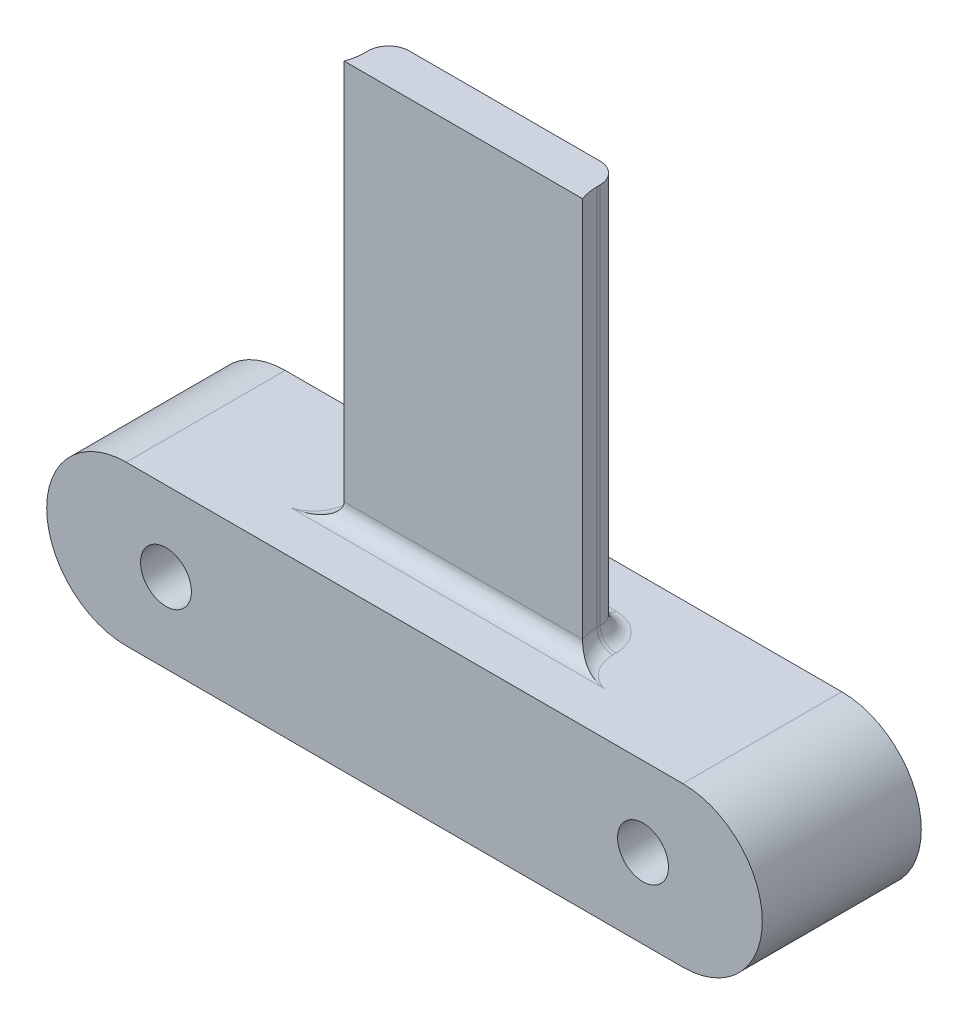
ISO-10303-21;
HEADER;
FILE_DESCRIPTION(('STEP AP214'),'2;1');
FILE_NAME('part.step','',(''),(''),'','','');
FILE_SCHEMA(('AUTOMOTIVE_DESIGN { 1 0 10303 214 1 1 1 1 }'));
ENDSEC;
DATA;
#1=APPLICATION_CONTEXT('core data for automotive mechanical design processes');
#2=APPLICATION_PROTOCOL_DEFINITION('international standard','automotive_design',2000,#1);
#3=PRODUCT_CONTEXT('',#1,'mechanical');
#4=PRODUCT('Part','Part','',(#3));
#5=PRODUCT_RELATED_PRODUCT_CATEGORY('part','',(#4));
#6=PRODUCT_DEFINITION_FORMATION('','',#4);
#7=PRODUCT_DEFINITION_CONTEXT('part definition',#1,'design');
#8=PRODUCT_DEFINITION('design','',#6,#7);
#9=PRODUCT_DEFINITION_SHAPE('','',#8);
#10=(LENGTH_UNIT() NAMED_UNIT(*) SI_UNIT(.MILLI.,.METRE.));
#11=(NAMED_UNIT(*) PLANE_ANGLE_UNIT() SI_UNIT($,.RADIAN.));
#12=(NAMED_UNIT(*) SI_UNIT($,.STERADIAN.) SOLID_ANGLE_UNIT());
#13=UNCERTAINTY_MEASURE_WITH_UNIT(LENGTH_MEASURE(1.E-05),#10,'distance_accuracy_value','');
#14=(GEOMETRIC_REPRESENTATION_CONTEXT(3) GLOBAL_UNCERTAINTY_ASSIGNED_CONTEXT((#13)) GLOBAL_UNIT_ASSIGNED_CONTEXT((#10,
#11,#12)) REPRESENTATION_CONTEXT('',''));
#15=CARTESIAN_POINT('',(0.,0.,0.));
#16=DIRECTION('',(0.,0.,1.));
#17=DIRECTION('',(1.,0.,0.));
#18=AXIS2_PLACEMENT_3D('',#15,#16,#17);
#19=CARTESIAN_POINT('',(17.5,0.,5.));
#20=DIRECTION('',(0.,0.,-1.));
#21=DIRECTION('',(-1.,0.,0.));
#22=AXIS2_PLACEMENT_3D('',#19,#20,#21);
#23=CYLINDRICAL_SURFACE('',#22,5.);
#24=DIRECTION('',(0.,0.,-1.));
#25=VECTOR('',#24,1.);
#26=CARTESIAN_POINT('',(17.5,4.99999999999999,5.));
#27=LINE('',#26,#25);
#28=CARTESIAN_POINT('',(17.5,4.99999999999999,5.));
#29=VERTEX_POINT('',#28);
#30=CARTESIAN_POINT('',(17.5,4.99999999999999,-5.));
#31=VERTEX_POINT('',#30);
#32=EDGE_CURVE('E351',#29,#31,#27,.T.);
#33=ORIENTED_EDGE('',*,*,#32,.F.);
#34=CARTESIAN_POINT('',(17.5,0.,5.));
#35=DIRECTION('',(0.,0.,-1.));
#36=DIRECTION('',(-1.,0.,0.));
#37=AXIS2_PLACEMENT_3D('',#34,#35,#36);
#38=CIRCLE('',#37,5.);
#39=CARTESIAN_POINT('',(17.5,-5.,5.));
#40=VERTEX_POINT('',#39);
#41=EDGE_CURVE('E357',#40,#29,#38,.F.);
#42=ORIENTED_EDGE('',*,*,#41,.F.);
#43=DIRECTION('',(0.,0.,-1.));
#44=VECTOR('',#43,1.);
#45=CARTESIAN_POINT('',(17.5,-5.,5.));
#46=LINE('',#45,#44);
#47=CARTESIAN_POINT('',(17.5,-5.,-5.));
#48=VERTEX_POINT('',#47);
#49=EDGE_CURVE('E354',#48,#40,#46,.F.);
#50=ORIENTED_EDGE('',*,*,#49,.F.);
#51=CARTESIAN_POINT('',(17.5,0.,-5.));
#52=DIRECTION('',(0.,0.,-1.));
#53=DIRECTION('',(-1.,0.,0.));
#54=AXIS2_PLACEMENT_3D('',#51,#52,#53);
#55=CIRCLE('',#54,5.);
#56=EDGE_CURVE('E359',#31,#48,#55,.T.);
#57=ORIENTED_EDGE('',*,*,#56,.F.);
#58=EDGE_LOOP('',(#33,#42,#50,#57));
#59=FACE_BOUND('',#58,.T.);
#60=ADVANCED_FACE('F40',(#59),#23,.T.);
#61=CARTESIAN_POINT('',(-17.5,0.,-5.));
#62=DIRECTION('',(0.,0.,-1.));
#63=DIRECTION('',(-1.,0.,0.));
#64=AXIS2_PLACEMENT_3D('',#61,#62,#63);
#65=CYLINDRICAL_SURFACE('',#64,5.);
#66=DIRECTION('',(0.,0.,-1.));
#67=VECTOR('',#66,1.);
#68=CARTESIAN_POINT('',(-17.5,4.99999999999999,5.));
#69=LINE('',#68,#67);
#70=CARTESIAN_POINT('',(-17.5,4.99999999999999,-5.));
#71=VERTEX_POINT('',#70);
#72=CARTESIAN_POINT('',(-17.5,4.99999999999999,5.));
#73=VERTEX_POINT('',#72);
#74=EDGE_CURVE('E337',#71,#73,#69,.F.);
#75=ORIENTED_EDGE('',*,*,#74,.F.);
#76=CARTESIAN_POINT('',(-17.5,0.,-5.));
#77=DIRECTION('',(0.,0.,-1.));
#78=DIRECTION('',(-1.,0.,0.));
#79=AXIS2_PLACEMENT_3D('',#76,#77,#78);
#80=CIRCLE('',#79,5.);
#81=CARTESIAN_POINT('',(-17.5,-5.,-5.));
#82=VERTEX_POINT('',#81);
#83=EDGE_CURVE('E346',#82,#71,#80,.T.);
#84=ORIENTED_EDGE('',*,*,#83,.F.);
#85=DIRECTION('',(0.,0.,-1.));
#86=VECTOR('',#85,1.);
#87=CARTESIAN_POINT('',(-17.5,-5.,5.));
#88=LINE('',#87,#86);
#89=CARTESIAN_POINT('',(-17.5,-5.,5.));
#90=VERTEX_POINT('',#89);
#91=EDGE_CURVE('E343',#90,#82,#88,.T.);
#92=ORIENTED_EDGE('',*,*,#91,.F.);
#93=CARTESIAN_POINT('',(-17.5,0.,5.));
#94=DIRECTION('',(0.,0.,-1.));
#95=DIRECTION('',(-1.,0.,0.));
#96=AXIS2_PLACEMENT_3D('',#93,#94,#95);
#97=CIRCLE('',#96,5.);
#98=EDGE_CURVE('E349',#73,#90,#97,.F.);
#99=ORIENTED_EDGE('',*,*,#98,.F.);
#100=EDGE_LOOP('',(#75,#84,#92,#99));
#101=FACE_BOUND('',#100,.T.);
#102=ADVANCED_FACE('F494',(#101),#65,.T.);
#103=CARTESIAN_POINT('',(0.,0.,5.));
#104=DIRECTION('',(0.,0.,-1.));
#105=DIRECTION('',(-1.,0.,0.));
#106=AXIS2_PLACEMENT_3D('',#103,#104,#105);
#107=PLANE('',#106);
#108=DIRECTION('',(1.,0.,0.));
#109=VECTOR('',#108,1.);
#110=CARTESIAN_POINT('',(-22.5,-5.,5.));
#111=LINE('',#110,#109);
#112=EDGE_CURVE('E333',#90,#40,#111,.T.);
#113=ORIENTED_EDGE('',*,*,#112,.T.);
#114=ORIENTED_EDGE('',*,*,#41,.T.);
#115=DIRECTION('',(-1.,0.,0.));
#116=VECTOR('',#115,1.);
#117=CARTESIAN_POINT('',(-22.5,4.99999999999999,5.));
#118=LINE('',#117,#116);
#119=EDGE_CURVE('E331',#29,#73,#118,.T.);
#120=ORIENTED_EDGE('',*,*,#119,.T.);
#121=ORIENTED_EDGE('',*,*,#98,.T.);
#122=EDGE_LOOP('',(#113,#114,#120,#121));
#123=FACE_BOUND('',#122,.T.);
#124=CARTESIAN_POINT('',(-15.,0.,5.));
#125=DIRECTION('',(0.,0.,1.));
#126=DIRECTION('',(1.,0.,0.));
#127=AXIS2_PLACEMENT_3D('',#124,#125,#126);
#128=CIRCLE('',#127,1.6);
#129=CARTESIAN_POINT('',(-13.4,0.,5.));
#130=VERTEX_POINT('',#129);
#131=EDGE_CURVE('E325',#130,#130,#128,.T.);
#132=ORIENTED_EDGE('',*,*,#131,.F.);
#133=EDGE_LOOP('',(#132));
#134=FACE_BOUND('',#133,.T.);
#135=CARTESIAN_POINT('',(15.,0.,5.));
#136=DIRECTION('',(0.,0.,1.));
#137=DIRECTION('',(-1.,0.,0.));
#138=AXIS2_PLACEMENT_3D('',#135,#136,#137);
#139=CIRCLE('',#138,1.6);
#140=CARTESIAN_POINT('',(13.4,0.,5.));
#141=VERTEX_POINT('',#140);
#142=EDGE_CURVE('E319',#141,#141,#139,.T.);
#143=ORIENTED_EDGE('',*,*,#142,.F.);
#144=EDGE_LOOP('',(#143));
#145=FACE_BOUND('',#144,.T.);
#146=ADVANCED_FACE('F499',(#123,#134,#145),#107,.F.);
#147=CARTESIAN_POINT('',(0.,0.,-5.));
#148=DIRECTION('',(0.,0.,-1.));
#149=DIRECTION('',(-1.,0.,0.));
#150=AXIS2_PLACEMENT_3D('',#147,#148,#149);
#151=PLANE('',#150);
#152=CARTESIAN_POINT('',(-15.,0.,-5.));
#153=DIRECTION('',(0.,0.,1.));
#154=DIRECTION('',(1.,0.,0.));
#155=AXIS2_PLACEMENT_3D('',#152,#153,#154);
#156=CIRCLE('',#155,1.6);
#157=CARTESIAN_POINT('',(-13.4,0.,-5.));
#158=VERTEX_POINT('',#157);
#159=EDGE_CURVE('E322',#158,#158,#156,.T.);
#160=ORIENTED_EDGE('',*,*,#159,.T.);
#161=EDGE_LOOP('',(#160));
#162=FACE_BOUND('',#161,.T.);
#163=DIRECTION('',(-1.,0.,0.));
#164=VECTOR('',#163,1.);
#165=CARTESIAN_POINT('',(-22.5,4.99999999999999,-5.));
#166=LINE('',#165,#164);
#167=EDGE_CURVE('E328',#31,#71,#166,.T.);
#168=ORIENTED_EDGE('',*,*,#167,.F.);
#169=ORIENTED_EDGE('',*,*,#56,.T.);
#170=DIRECTION('',(1.,0.,0.));
#171=VECTOR('',#170,1.);
#172=CARTESIAN_POINT('',(-22.5,-5.,-5.));
#173=LINE('',#172,#171);
#174=EDGE_CURVE('E334',#82,#48,#173,.T.);
#175=ORIENTED_EDGE('',*,*,#174,.F.);
#176=ORIENTED_EDGE('',*,*,#83,.T.);
#177=EDGE_LOOP('',(#168,#169,#175,#176));
#178=FACE_BOUND('',#177,.T.);
#179=CARTESIAN_POINT('',(15.,0.,-5.));
#180=DIRECTION('',(0.,0.,1.));
#181=DIRECTION('',(-1.,0.,0.));
#182=AXIS2_PLACEMENT_3D('',#179,#180,#181);
#183=CIRCLE('',#182,1.6);
#184=CARTESIAN_POINT('',(13.4,0.,-5.));
#185=VERTEX_POINT('',#184);
#186=EDGE_CURVE('E318',#185,#185,#183,.T.);
#187=ORIENTED_EDGE('',*,*,#186,.T.);
#188=EDGE_LOOP('',(#187));
#189=FACE_BOUND('',#188,.T.);
#190=ADVANCED_FACE('F513',(#162,#178,#189),#151,.T.);
#191=CARTESIAN_POINT('',(-22.5,4.99999999999999,5.));
#192=DIRECTION('',(0.,-1.,0.));
#193=DIRECTION('',(1.,0.,0.));
#194=AXIS2_PLACEMENT_3D('',#191,#192,#193);
#195=PLANE('',#194);
#196=DIRECTION('',(0.,0.,1.));
#197=VECTOR('',#196,1.);
#198=CARTESIAN_POINT('',(8.29999999999994,4.99999999999999,5.0000000000004));
#199=LINE('',#198,#197);
#200=CARTESIAN_POINT('',(8.3,4.99999999999999,0.));
#201=VERTEX_POINT('',#200);
#202=CARTESIAN_POINT('',(8.3,4.99999999999999,0.200000000000004));
#203=VERTEX_POINT('',#202);
#204=EDGE_CURVE('E373',#201,#203,#199,.T.);
#205=ORIENTED_EDGE('',*,*,#204,.T.);
#206=CARTESIAN_POINT('',(10.5,4.99999999999999,0.200000000000003));
#207=DIRECTION('',(0.,-1.,0.));
#208=DIRECTION('',(1.,0.,0.));
#209=AXIS2_PLACEMENT_3D('',#206,#207,#208);
#210=CIRCLE('',#209,2.2);
#211=CARTESIAN_POINT('',(9.84425614756978,4.99999999999999,2.3));
#212=VERTEX_POINT('',#211);
#213=EDGE_CURVE('E375',#203,#212,#210,.F.);
#214=ORIENTED_EDGE('',*,*,#213,.T.);
#215=DIRECTION('',(1.,0.,0.));
#216=VECTOR('',#215,1.);
#217=CARTESIAN_POINT('',(-7.49500415973665,4.99999999999999,2.3));
#218=LINE('',#217,#216);
#219=CARTESIAN_POINT('',(-9.84425614756978,4.99999999999999,2.3));
#220=VERTEX_POINT('',#219);
#221=EDGE_CURVE('E361',#212,#220,#218,.F.);
#222=ORIENTED_EDGE('',*,*,#221,.T.);
#223=CARTESIAN_POINT('',(-10.5,4.99999999999999,0.200000000000005));
#224=DIRECTION('',(0.,-1.,0.));
#225=DIRECTION('',(1.,0.,0.));
#226=AXIS2_PLACEMENT_3D('',#223,#224,#225);
#227=CIRCLE('',#226,2.2);
#228=CARTESIAN_POINT('',(-8.3,4.99999999999999,0.200000000000005));
#229=VERTEX_POINT('',#228);
#230=EDGE_CURVE('E363',#220,#229,#227,.F.);
#231=ORIENTED_EDGE('',*,*,#230,.T.);
#232=DIRECTION('',(0.,0.,1.));
#233=VECTOR('',#232,1.);
#234=CARTESIAN_POINT('',(-8.3,4.99999999999999,0.));
#235=LINE('',#234,#233);
#236=CARTESIAN_POINT('',(-8.3,4.99999999999999,0.));
#237=VERTEX_POINT('',#236);
#238=EDGE_CURVE('E365',#229,#237,#235,.F.);
#239=ORIENTED_EDGE('',*,*,#238,.T.);
#240=CARTESIAN_POINT('',(-6.,4.99999999999999,0.));
#241=DIRECTION('',(0.,-1.,0.));
#242=DIRECTION('',(1.,0.,0.));
#243=AXIS2_PLACEMENT_3D('',#240,#241,#242);
#244=CIRCLE('',#243,2.3);
#245=CARTESIAN_POINT('',(-6.00000000000001,4.99999999999999,-2.3));
#246=VERTEX_POINT('',#245);
#247=EDGE_CURVE('E367',#237,#246,#244,.T.);
#248=ORIENTED_EDGE('',*,*,#247,.T.);
#249=DIRECTION('',(1.,0.,0.));
#250=VECTOR('',#249,1.);
#251=CARTESIAN_POINT('',(-22.5,4.99999999999999,-2.3));
#252=LINE('',#251,#250);
#253=CARTESIAN_POINT('',(6.00000000000001,4.99999999999999,-2.3));
#254=VERTEX_POINT('',#253);
#255=EDGE_CURVE('E369',#246,#254,#252,.T.);
#256=ORIENTED_EDGE('',*,*,#255,.T.);
#257=CARTESIAN_POINT('',(6.,4.99999999999999,0.));
#258=DIRECTION('',(0.,-1.,0.));
#259=DIRECTION('',(1.,0.,0.));
#260=AXIS2_PLACEMENT_3D('',#257,#258,#259);
#261=CIRCLE('',#260,2.3);
#262=EDGE_CURVE('E371',#254,#201,#261,.T.);
#263=ORIENTED_EDGE('',*,*,#262,.T.);
#264=EDGE_LOOP('',(#205,#214,#222,#231,#239,#248,#256,#263));
#265=FACE_BOUND('',#264,.T.);
#266=ORIENTED_EDGE('',*,*,#119,.F.);
#267=ORIENTED_EDGE('',*,*,#32,.T.);
#268=ORIENTED_EDGE('',*,*,#167,.T.);
#269=ORIENTED_EDGE('',*,*,#74,.T.);
#270=EDGE_LOOP('',(#266,#267,#268,#269));
#271=FACE_BOUND('',#270,.T.);
#272=ADVANCED_FACE('F470',(#265,#271),#195,.F.);
#273=CARTESIAN_POINT('',(-22.5,-5.,5.));
#274=DIRECTION('',(0.,1.,0.));
#275=DIRECTION('',(-1.,0.,0.));
#276=AXIS2_PLACEMENT_3D('',#273,#274,#275);
#277=PLANE('',#276);
#278=ORIENTED_EDGE('',*,*,#174,.T.);
#279=ORIENTED_EDGE('',*,*,#49,.T.);
#280=ORIENTED_EDGE('',*,*,#112,.F.);
#281=ORIENTED_EDGE('',*,*,#91,.T.);
#282=EDGE_LOOP('',(#278,#279,#280,#281));
#283=FACE_BOUND('',#282,.T.);
#284=ADVANCED_FACE('F512',(#283),#277,.F.);
#285=CARTESIAN_POINT('',(-15.,0.,5.));
#286=DIRECTION('',(0.,0.,-1.));
#287=DIRECTION('',(-1.,0.,0.));
#288=AXIS2_PLACEMENT_3D('',#285,#286,#287);
#289=CYLINDRICAL_SURFACE('',#288,1.6);
#290=ORIENTED_EDGE('',*,*,#131,.T.);
#291=EDGE_LOOP('',(#290));
#292=FACE_BOUND('',#291,.T.);
#293=ORIENTED_EDGE('',*,*,#159,.F.);
#294=EDGE_LOOP('',(#293));
#295=FACE_BOUND('',#294,.T.);
#296=ADVANCED_FACE('F516',(#292,#295),#289,.F.);
#297=CARTESIAN_POINT('',(15.,0.,5.));
#298=DIRECTION('',(0.,0.,-1.));
#299=DIRECTION('',(-1.,0.,0.));
#300=AXIS2_PLACEMENT_3D('',#297,#298,#299);
#301=CYLINDRICAL_SURFACE('',#300,1.6);
#302=ORIENTED_EDGE('',*,*,#142,.T.);
#303=EDGE_LOOP('',(#302));
#304=FACE_BOUND('',#303,.T.);
#305=ORIENTED_EDGE('',*,*,#186,.F.);
#306=EDGE_LOOP('',(#305));
#307=FACE_BOUND('',#306,.T.);
#308=ADVANCED_FACE('F526',(#304,#307),#301,.F.);
#309=CARTESIAN_POINT('',(0.,30.,-1.3));
#310=DIRECTION('',(0.,0.,-1.));
#311=DIRECTION('',(-1.,0.,0.));
#312=AXIS2_PLACEMENT_3D('',#309,#310,#311);
#313=PLANE('',#312);
#314=DIRECTION('',(0.,-1.,0.));
#315=VECTOR('',#314,1.);
#316=CARTESIAN_POINT('',(6.,30.,-1.3));
#317=LINE('',#316,#315);
#318=CARTESIAN_POINT('',(6.,30.,-1.3));
#319=VERTEX_POINT('',#318);
#320=CARTESIAN_POINT('',(6.,5.99999999999999,-1.3));
#321=VERTEX_POINT('',#320);
#322=EDGE_CURVE('E297',#319,#321,#317,.T.);
#323=ORIENTED_EDGE('',*,*,#322,.T.);
#324=DIRECTION('',(1.,0.,0.));
#325=VECTOR('',#324,1.);
#326=CARTESIAN_POINT('',(0.,5.99999999999999,-1.3));
#327=LINE('',#326,#325);
#328=CARTESIAN_POINT('',(-6.00000000000001,5.99999999999999,-1.3));
#329=VERTEX_POINT('',#328);
#330=EDGE_CURVE('E385',#321,#329,#327,.F.);
#331=ORIENTED_EDGE('',*,*,#330,.T.);
#332=DIRECTION('',(0.,-1.,0.));
#333=VECTOR('',#332,1.);
#334=CARTESIAN_POINT('',(-6.00000000000001,30.,-1.3));
#335=LINE('',#334,#333);
#336=CARTESIAN_POINT('',(-6.00000000000001,30.,-1.3));
#337=VERTEX_POINT('',#336);
#338=EDGE_CURVE('E315',#337,#329,#335,.T.);
#339=ORIENTED_EDGE('',*,*,#338,.F.);
#340=DIRECTION('',(1.,0.,0.));
#341=VECTOR('',#340,1.);
#342=CARTESIAN_POINT('',(0.,30.,-1.3));
#343=LINE('',#342,#341);
#344=EDGE_CURVE('E277',#337,#319,#343,.T.);
#345=ORIENTED_EDGE('',*,*,#344,.T.);
#346=EDGE_LOOP('',(#323,#331,#339,#345));
#347=FACE_BOUND('',#346,.T.);
#348=ADVANCED_FACE('F456',(#347),#313,.T.);
#349=CARTESIAN_POINT('',(-6.,30.,0.));
#350=DIRECTION('',(0.,-1.,0.));
#351=DIRECTION('',(1.,0.,0.));
#352=AXIS2_PLACEMENT_3D('',#349,#350,#351);
#353=CYLINDRICAL_SURFACE('',#352,1.3);
#354=ORIENTED_EDGE('',*,*,#338,.T.);
#355=CARTESIAN_POINT('',(-6.,5.99999999999999,0.));
#356=DIRECTION('',(0.,-1.,0.));
#357=DIRECTION('',(1.,0.,0.));
#358=AXIS2_PLACEMENT_3D('',#355,#356,#357);
#359=CIRCLE('',#358,1.3);
#360=CARTESIAN_POINT('',(-7.3,5.99999999999999,0.));
#361=VERTEX_POINT('',#360);
#362=EDGE_CURVE('E387',#329,#361,#359,.F.);
#363=ORIENTED_EDGE('',*,*,#362,.T.);
#364=DIRECTION('',(0.,-1.,0.));
#365=VECTOR('',#364,1.);
#366=CARTESIAN_POINT('',(-7.3,30.,0.));
#367=LINE('',#366,#365);
#368=CARTESIAN_POINT('',(-7.3,30.,0.));
#369=VERTEX_POINT('',#368);
#370=EDGE_CURVE('E313',#369,#361,#367,.T.);
#371=ORIENTED_EDGE('',*,*,#370,.F.);
#372=CARTESIAN_POINT('',(-6.,30.,0.));
#373=DIRECTION('',(0.,1.,0.));
#374=DIRECTION('',(-1.,0.,0.));
#375=AXIS2_PLACEMENT_3D('',#372,#373,#374);
#376=CIRCLE('',#375,1.3);
#377=EDGE_CURVE('E280',#337,#369,#376,.T.);
#378=ORIENTED_EDGE('',*,*,#377,.F.);
#379=EDGE_LOOP('',(#354,#363,#371,#378));
#380=FACE_BOUND('',#379,.T.);
#381=ADVANCED_FACE('F445',(#380),#353,.T.);
#382=CARTESIAN_POINT('',(-7.3,30.,0.));
#383=DIRECTION('',(1.,0.,0.));
#384=DIRECTION('',(0.,1.,0.));
#385=AXIS2_PLACEMENT_3D('',#382,#383,#384);
#386=PLANE('',#385);
#387=ORIENTED_EDGE('',*,*,#370,.T.);
#388=DIRECTION('',(0.,0.,1.));
#389=VECTOR('',#388,1.);
#390=CARTESIAN_POINT('',(-7.3,5.99999999999999,0.200000000000005));
#391=LINE('',#390,#389);
#392=CARTESIAN_POINT('',(-7.3,5.99999999999999,0.200000000000005));
#393=VERTEX_POINT('',#392);
#394=EDGE_CURVE('E64',#361,#393,#391,.T.);
#395=ORIENTED_EDGE('',*,*,#394,.T.);
#396=DIRECTION('',(0.,-1.,0.));
#397=VECTOR('',#396,1.);
#398=CARTESIAN_POINT('',(-7.3,30.,0.200000000000005));
#399=LINE('',#398,#397);
#400=CARTESIAN_POINT('',(-7.3,30.,0.200000000000005));
#401=VERTEX_POINT('',#400);
#402=EDGE_CURVE('E311',#401,#393,#399,.T.);
#403=ORIENTED_EDGE('',*,*,#402,.F.);
#404=DIRECTION('',(0.,0.,1.));
#405=VECTOR('',#404,1.);
#406=CARTESIAN_POINT('',(-7.3,30.,0.));
#407=LINE('',#406,#405);
#408=EDGE_CURVE('E282',#369,#401,#407,.T.);
#409=ORIENTED_EDGE('',*,*,#408,.F.);
#410=EDGE_LOOP('',(#387,#395,#403,#409));
#411=FACE_BOUND('',#410,.T.);
#412=ADVANCED_FACE('F448',(#411),#386,.F.);
#413=CARTESIAN_POINT('',(-10.5,30.,0.200000000000005));
#414=DIRECTION('',(0.,-1.,0.));
#415=DIRECTION('',(1.,0.,0.));
#416=AXIS2_PLACEMENT_3D('',#413,#414,#415);
#417=CYLINDRICAL_SURFACE('',#416,3.2);
#418=ORIENTED_EDGE('',*,*,#402,.T.);
#419=CARTESIAN_POINT('',(-10.5,5.99999999999999,0.200000000000005));
#420=DIRECTION('',(0.,-1.,0.));
#421=DIRECTION('',(1.,0.,0.));
#422=AXIS2_PLACEMENT_3D('',#419,#420,#421);
#423=CIRCLE('',#422,3.2);
#424=CARTESIAN_POINT('',(-7.49500415973665,5.99999999999999,1.3));
#425=VERTEX_POINT('',#424);
#426=EDGE_CURVE('E49',#393,#425,#423,.T.);
#427=ORIENTED_EDGE('',*,*,#426,.T.);
#428=DIRECTION('',(0.,-1.,0.));
#429=VECTOR('',#428,1.);
#430=CARTESIAN_POINT('',(-7.49500415973666,30.,1.3));
#431=LINE('',#430,#429);
#432=CARTESIAN_POINT('',(-7.49500415973666,30.,1.3));
#433=VERTEX_POINT('',#432);
#434=EDGE_CURVE('E309',#433,#425,#431,.T.);
#435=ORIENTED_EDGE('',*,*,#434,.F.);
#436=CARTESIAN_POINT('',(-10.5,30.,0.200000000000005));
#437=DIRECTION('',(0.,1.,0.));
#438=DIRECTION('',(-1.,0.,0.));
#439=AXIS2_PLACEMENT_3D('',#436,#437,#438);
#440=CIRCLE('',#439,3.2);
#441=EDGE_CURVE('E284',#401,#433,#440,.F.);
#442=ORIENTED_EDGE('',*,*,#441,.F.);
#443=EDGE_LOOP('',(#418,#427,#435,#442));
#444=FACE_BOUND('',#443,.T.);
#445=ADVANCED_FACE('F537',(#444),#417,.F.);
#446=CARTESIAN_POINT('',(0.,30.,1.3));
#447=DIRECTION('',(0.,0.,-1.));
#448=DIRECTION('',(-1.,0.,0.));
#449=AXIS2_PLACEMENT_3D('',#446,#447,#448);
#450=PLANE('',#449);
#451=ORIENTED_EDGE('',*,*,#434,.T.);
#452=DIRECTION('',(1.,0.,0.));
#453=VECTOR('',#452,1.);
#454=CARTESIAN_POINT('',(7.49500415973665,6.,1.3));
#455=LINE('',#454,#453);
#456=CARTESIAN_POINT('',(7.49500415973665,5.99999999999999,1.3));
#457=VERTEX_POINT('',#456);
#458=EDGE_CURVE('E11',#425,#457,#455,.T.);
#459=ORIENTED_EDGE('',*,*,#458,.T.);
#460=DIRECTION('',(0.,-1.,0.));
#461=VECTOR('',#460,1.);
#462=CARTESIAN_POINT('',(7.49500415973665,30.,1.3));
#463=LINE('',#462,#461);
#464=CARTESIAN_POINT('',(7.49500415973665,30.,1.3));
#465=VERTEX_POINT('',#464);
#466=EDGE_CURVE('E306',#465,#457,#463,.T.);
#467=ORIENTED_EDGE('',*,*,#466,.F.);
#468=DIRECTION('',(1.,0.,0.));
#469=VECTOR('',#468,1.);
#470=CARTESIAN_POINT('',(0.,30.,1.3));
#471=LINE('',#470,#469);
#472=EDGE_CURVE('E286',#433,#465,#471,.T.);
#473=ORIENTED_EDGE('',*,*,#472,.F.);
#474=EDGE_LOOP('',(#451,#459,#467,#473));
#475=FACE_BOUND('',#474,.T.);
#476=ADVANCED_FACE('F482',(#475),#450,.F.);
#477=CARTESIAN_POINT('',(10.5,30.,0.200000000000003));
#478=DIRECTION('',(0.,-1.,0.));
#479=DIRECTION('',(1.,0.,0.));
#480=AXIS2_PLACEMENT_3D('',#477,#478,#479);
#481=CYLINDRICAL_SURFACE('',#480,3.2);
#482=ORIENTED_EDGE('',*,*,#466,.T.);
#483=CARTESIAN_POINT('',(10.5,5.99999999999999,0.200000000000003));
#484=DIRECTION('',(0.,-1.,0.));
#485=DIRECTION('',(1.,0.,0.));
#486=AXIS2_PLACEMENT_3D('',#483,#484,#485);
#487=CIRCLE('',#486,3.2);
#488=CARTESIAN_POINT('',(7.3,5.99999999999999,0.200000000000004));
#489=VERTEX_POINT('',#488);
#490=EDGE_CURVE('E378',#457,#489,#487,.T.);
#491=ORIENTED_EDGE('',*,*,#490,.T.);
#492=DIRECTION('',(0.,-1.,0.));
#493=VECTOR('',#492,1.);
#494=CARTESIAN_POINT('',(7.3,30.,0.200000000000004));
#495=LINE('',#494,#493);
#496=CARTESIAN_POINT('',(7.3,30.,0.200000000000004));
#497=VERTEX_POINT('',#496);
#498=EDGE_CURVE('E303',#497,#489,#495,.T.);
#499=ORIENTED_EDGE('',*,*,#498,.F.);
#500=CARTESIAN_POINT('',(10.5,30.,0.200000000000003));
#501=DIRECTION('',(0.,1.,0.));
#502=DIRECTION('',(-1.,0.,0.));
#503=AXIS2_PLACEMENT_3D('',#500,#501,#502);
#504=CIRCLE('',#503,3.2);
#505=EDGE_CURVE('E288',#497,#465,#504,.T.);
#506=ORIENTED_EDGE('',*,*,#505,.T.);
#507=EDGE_LOOP('',(#482,#491,#499,#506));
#508=FACE_BOUND('',#507,.T.);
#509=ADVANCED_FACE('F486',(#508),#481,.F.);
#510=CARTESIAN_POINT('',(7.3,30.,0.));
#511=DIRECTION('',(1.,0.,0.));
#512=DIRECTION('',(0.,0.,-1.));
#513=AXIS2_PLACEMENT_3D('',#510,#511,#512);
#514=PLANE('',#513);
#515=ORIENTED_EDGE('',*,*,#498,.T.);
#516=DIRECTION('',(0.,0.,1.));
#517=VECTOR('',#516,1.);
#518=CARTESIAN_POINT('',(7.3,5.99999999999999,0.));
#519=LINE('',#518,#517);
#520=CARTESIAN_POINT('',(7.3,5.99999999999999,0.));
#521=VERTEX_POINT('',#520);
#522=EDGE_CURVE('E381',#489,#521,#519,.F.);
#523=ORIENTED_EDGE('',*,*,#522,.T.);
#524=DIRECTION('',(0.,-1.,0.));
#525=VECTOR('',#524,1.);
#526=CARTESIAN_POINT('',(7.3,30.,0.));
#527=LINE('',#526,#525);
#528=CARTESIAN_POINT('',(7.3,30.,0.));
#529=VERTEX_POINT('',#528);
#530=EDGE_CURVE('E300',#529,#521,#527,.T.);
#531=ORIENTED_EDGE('',*,*,#530,.F.);
#532=DIRECTION('',(0.,0.,1.));
#533=VECTOR('',#532,1.);
#534=CARTESIAN_POINT('',(7.3,30.,0.));
#535=LINE('',#534,#533);
#536=EDGE_CURVE('E291',#529,#497,#535,.T.);
#537=ORIENTED_EDGE('',*,*,#536,.T.);
#538=EDGE_LOOP('',(#515,#523,#531,#537));
#539=FACE_BOUND('',#538,.T.);
#540=ADVANCED_FACE('F544',(#539),#514,.T.);
#541=CARTESIAN_POINT('',(6.,30.,0.));
#542=DIRECTION('',(0.,-1.,0.));
#543=DIRECTION('',(1.,0.,0.));
#544=AXIS2_PLACEMENT_3D('',#541,#542,#543);
#545=CYLINDRICAL_SURFACE('',#544,1.3);
#546=ORIENTED_EDGE('',*,*,#530,.T.);
#547=CARTESIAN_POINT('',(6.,5.99999999999999,0.));
#548=DIRECTION('',(0.,-1.,0.));
#549=DIRECTION('',(1.,0.,0.));
#550=AXIS2_PLACEMENT_3D('',#547,#548,#549);
#551=CIRCLE('',#550,1.3);
#552=EDGE_CURVE('E383',#521,#321,#551,.F.);
#553=ORIENTED_EDGE('',*,*,#552,.T.);
#554=ORIENTED_EDGE('',*,*,#322,.F.);
#555=CARTESIAN_POINT('',(6.,30.,0.));
#556=DIRECTION('',(0.,1.,0.));
#557=DIRECTION('',(-1.,0.,0.));
#558=AXIS2_PLACEMENT_3D('',#555,#556,#557);
#559=CIRCLE('',#558,1.3);
#560=EDGE_CURVE('E294',#319,#529,#559,.F.);
#561=ORIENTED_EDGE('',*,*,#560,.T.);
#562=EDGE_LOOP('',(#546,#553,#554,#561));
#563=FACE_BOUND('',#562,.T.);
#564=ADVANCED_FACE('F458',(#563),#545,.T.);
#565=CARTESIAN_POINT('',(0.,30.,0.));
#566=DIRECTION('',(0.,1.,0.));
#567=DIRECTION('',(-1.,0.,0.));
#568=AXIS2_PLACEMENT_3D('',#565,#566,#567);
#569=PLANE('',#568);
#570=ORIENTED_EDGE('',*,*,#344,.F.);
#571=ORIENTED_EDGE('',*,*,#377,.T.);
#572=ORIENTED_EDGE('',*,*,#408,.T.);
#573=ORIENTED_EDGE('',*,*,#441,.T.);
#574=ORIENTED_EDGE('',*,*,#472,.T.);
#575=ORIENTED_EDGE('',*,*,#505,.F.);
#576=ORIENTED_EDGE('',*,*,#536,.F.);
#577=ORIENTED_EDGE('',*,*,#560,.F.);
#578=EDGE_LOOP('',(#570,#571,#572,#573,#574,#575,#576,#577));
#579=FACE_BOUND('',#578,.T.);
#580=ADVANCED_FACE('F452',(#579),#569,.T.);
#581=CARTESIAN_POINT('',(-6.,5.99999999999999,0.));
#582=DIRECTION('',(0.,-1.,0.));
#583=DIRECTION('',(1.,0.,0.));
#584=AXIS2_PLACEMENT_3D('',#581,#582,#583);
#585=TOROIDAL_SURFACE('',#584,2.3,1.);
#586=CARTESIAN_POINT('',(-8.3,5.99999999999999,0.));
#587=DIRECTION('',(0.,0.,-1.));
#588=DIRECTION('',(-1.,0.,0.));
#589=AXIS2_PLACEMENT_3D('',#586,#587,#588);
#590=CIRCLE('',#589,1.);
#591=EDGE_CURVE('E428',#361,#237,#590,.T.);
#592=ORIENTED_EDGE('',*,*,#591,.F.);
#593=ORIENTED_EDGE('',*,*,#362,.F.);
#594=CARTESIAN_POINT('',(-6.00000000000001,5.99999999999999,-2.3));
#595=DIRECTION('',(-1.,0.,0.));
#596=DIRECTION('',(0.,0.,1.));
#597=AXIS2_PLACEMENT_3D('',#594,#595,#596);
#598=CIRCLE('',#597,1.);
#599=EDGE_CURVE('E44',#246,#329,#598,.T.);
#600=ORIENTED_EDGE('',*,*,#599,.F.);
#601=ORIENTED_EDGE('',*,*,#247,.F.);
#602=EDGE_LOOP('',(#592,#593,#600,#601));
#603=FACE_BOUND('',#602,.T.);
#604=ADVANCED_FACE('F42',(#603),#585,.F.);
#605=CARTESIAN_POINT('',(-22.5,5.99999999999999,-2.3));
#606=DIRECTION('',(1.,0.,0.));
#607=DIRECTION('',(0.,1.,0.));
#608=AXIS2_PLACEMENT_3D('',#605,#606,#607);
#609=CYLINDRICAL_SURFACE('',#608,1.);
#610=ORIENTED_EDGE('',*,*,#599,.T.);
#611=ORIENTED_EDGE('',*,*,#330,.F.);
#612=CARTESIAN_POINT('',(6.00000000000001,5.99999999999999,-2.3));
#613=DIRECTION('',(-1.,0.,0.));
#614=DIRECTION('',(0.,0.,1.));
#615=AXIS2_PLACEMENT_3D('',#612,#613,#614);
#616=CIRCLE('',#615,1.);
#617=EDGE_CURVE('E426',#254,#321,#616,.T.);
#618=ORIENTED_EDGE('',*,*,#617,.F.);
#619=ORIENTED_EDGE('',*,*,#255,.F.);
#620=EDGE_LOOP('',(#610,#611,#618,#619));
#621=FACE_BOUND('',#620,.T.);
#622=ADVANCED_FACE('F438',(#621),#609,.F.);
#623=CARTESIAN_POINT('',(-8.3,5.99999999999999,0.));
#624=DIRECTION('',(0.,0.,-1.));
#625=DIRECTION('',(-1.,0.,0.));
#626=AXIS2_PLACEMENT_3D('',#623,#624,#625);
#627=CYLINDRICAL_SURFACE('',#626,1.);
#628=ORIENTED_EDGE('',*,*,#591,.T.);
#629=ORIENTED_EDGE('',*,*,#238,.F.);
#630=CARTESIAN_POINT('',(-8.3,5.99999999999999,0.200000000000005));
#631=DIRECTION('',(0.,0.,-1.));
#632=DIRECTION('',(-1.,0.,0.));
#633=AXIS2_PLACEMENT_3D('',#630,#631,#632);
#634=CIRCLE('',#633,1.);
#635=EDGE_CURVE('E423',#393,#229,#634,.T.);
#636=ORIENTED_EDGE('',*,*,#635,.F.);
#637=ORIENTED_EDGE('',*,*,#394,.F.);
#638=EDGE_LOOP('',(#628,#629,#636,#637));
#639=FACE_BOUND('',#638,.T.);
#640=ADVANCED_FACE('F474',(#639),#627,.F.);
#641=CARTESIAN_POINT('',(6.,5.99999999999999,0.));
#642=DIRECTION('',(0.,-1.,0.));
#643=DIRECTION('',(1.,0.,0.));
#644=AXIS2_PLACEMENT_3D('',#641,#642,#643);
#645=TOROIDAL_SURFACE('',#644,2.3,1.);
#646=ORIENTED_EDGE('',*,*,#617,.T.);
#647=ORIENTED_EDGE('',*,*,#552,.F.);
#648=CARTESIAN_POINT('',(8.3,5.99999999999999,0.));
#649=DIRECTION('',(0.,0.,-1.));
#650=DIRECTION('',(-1.,0.,0.));
#651=AXIS2_PLACEMENT_3D('',#648,#649,#650);
#652=CIRCLE('',#651,1.);
#653=EDGE_CURVE('E420',#201,#521,#652,.T.);
#654=ORIENTED_EDGE('',*,*,#653,.F.);
#655=ORIENTED_EDGE('',*,*,#262,.F.);
#656=EDGE_LOOP('',(#646,#647,#654,#655));
#657=FACE_BOUND('',#656,.T.);
#658=ADVANCED_FACE('F462',(#657),#645,.F.);
#659=CARTESIAN_POINT('',(-10.5,5.99999999999999,0.200000000000005));
#660=DIRECTION('',(0.,-1.,0.));
#661=DIRECTION('',(1.,0.,0.));
#662=AXIS2_PLACEMENT_3D('',#659,#660,#661);
#663=TOROIDAL_SURFACE('',#662,2.2,1.);
#664=ORIENTED_EDGE('',*,*,#635,.T.);
#665=ORIENTED_EDGE('',*,*,#230,.F.);
#666=CARTESIAN_POINT('',(-7.49500415973666,5.99999999999999,1.3));
#667=CARTESIAN_POINT('',(-7.49500003596253,5.98036140562731,1.29999631283593));
#668=CARTESIAN_POINT('',(-7.4958327511394,5.96073717686368,1.30057910978231));
#669=CARTESIAN_POINT('',(-7.49912492954155,5.92171484868174,1.30287825928945));
#670=CARTESIAN_POINT('',(-7.50158251350195,5.90231651434539,1.30459330233165));
#671=CARTESIAN_POINT('',(-7.51124437679396,5.8451661962126,1.31132353448063));
#672=CARTESIAN_POINT('',(-7.52074043950549,5.80796158480328,1.31792599947731));
#673=CARTESIAN_POINT('',(-7.54499613912903,5.73642082344336,1.33466223755376));
#674=CARTESIAN_POINT('',(-7.55973369012544,5.70207337251439,1.34478118927577));
#675=CARTESIAN_POINT('',(-7.59353585277836,5.63648363876801,1.36776200655355));
#676=CARTESIAN_POINT('',(-7.61261365223845,5.60525124590799,1.38063222445793));
#677=CARTESIAN_POINT('',(-7.6644016303379,5.53156984910457,1.41515529735947));
#678=CARTESIAN_POINT('',(-7.69920034106957,5.49116459826399,1.43801337804715));
#679=CARTESIAN_POINT('',(-7.77405805041703,5.41728716843994,1.48612192521418));
#680=CARTESIAN_POINT('',(-7.81412767535289,5.38382935675942,1.51137719506964));
#681=CARTESIAN_POINT('',(-7.89062134917044,5.32834144757556,1.55841175444551));
#682=CARTESIAN_POINT('',(-7.92645469982307,5.30533618825585,1.58002510105452));
#683=CARTESIAN_POINT('',(-8.00009828285816,5.26295949382452,1.62347114149581));
#684=CARTESIAN_POINT('',(-8.03790983852558,5.2435905319397,1.64530397405413));
#685=CARTESIAN_POINT('',(-8.15377760034381,5.19019101861179,1.71060306618684));
#686=CARTESIAN_POINT('',(-8.23418307106387,5.16092485349135,1.75381772379678));
#687=CARTESIAN_POINT('',(-8.38014333785981,5.11764869324218,1.82793854930036));
#688=CARTESIAN_POINT('',(-8.44488206586346,5.10167975440401,1.85939702933751));
#689=CARTESIAN_POINT('',(-8.57633002773888,5.07432574513535,1.92021034306119));
#690=CARTESIAN_POINT('',(-8.64304026186043,5.06294304593842,1.9495640820982));
#691=CARTESIAN_POINT('',(-8.7779780405452,5.04382118674113,2.00572022055479));
#692=CARTESIAN_POINT('',(-8.84620480155852,5.03608018897941,2.03252390138491));
#693=CARTESIAN_POINT('',(-8.98396309056488,5.02341133926777,2.08329961108794));
#694=CARTESIAN_POINT('',(-9.05349476371147,5.01848380221545,2.10727132275361));
#695=CARTESIAN_POINT('',(-9.19351016091709,5.01073832385755,2.15209019667038));
#696=CARTESIAN_POINT('',(-9.26399161829755,5.00791604017819,2.17294371913448));
#697=CARTESIAN_POINT('',(-9.40582163725047,5.00374790251264,2.21137196447717));
#698=CARTESIAN_POINT('',(-9.4771694487113,5.0024008521989,2.22894933450867));
#699=CARTESIAN_POINT('',(-9.61903294910851,5.00066638959251,2.2603272528295));
#700=CARTESIAN_POINT('',(-9.68953157102028,5.00025819268781,2.27420346466456));
#701=CARTESIAN_POINT('',(-9.7844467841594,5.00003635933059,2.29053097948119));
#702=CARTESIAN_POINT('',(-9.80861111456494,5.00000817474432,2.29448452031255));
#703=CARTESIAN_POINT('',(-9.83662221488344,5.00000050650827,2.29883075188246));
#704=CARTESIAN_POINT('',(-9.84043880063261,4.99999999816918,2.29941785896341));
#705=CARTESIAN_POINT('',(-9.84425614756978,4.99999999999999,2.3));
#706=B_SPLINE_CURVE_WITH_KNOTS('',3,(#666,#667,#668,#669,#670,#671,#672,#673,#674,#675,#676,
#677,#678,#679,#680,#681,#682,#683,#684,#685,#686,#687,#688,#689,#690,#691,#692,#693,#694,#695,
#696,#697,#698,#699,#700,#701,#702,#703,#704,#705),.UNSPECIFIED.,.F.,.F.,(4,2,2,2,2,2,2,2,2,2,2,
2,2,2,2,2,2,2,2,4),(0.,0.0588627712350535,0.11765758271362,0.233782283671417,0.349423360053775,
0.465420618131544,0.638500934340044,0.811935692212327,0.954993618395211,1.09814849565057,
1.3847966049033,1.60579800221303,1.82691351818241,2.04791732960566,2.26894587211426,
2.4895172426447,2.70990961000765,2.92537385943544,2.99882827671284,3.0104127046828),.UNSPECIFIED.);
#707=EDGE_CURVE('E413',#425,#220,#706,.T.);
#708=ORIENTED_EDGE('',*,*,#707,.F.);
#709=ORIENTED_EDGE('',*,*,#426,.F.);
#710=EDGE_LOOP('',(#664,#665,#708,#709));
#711=FACE_BOUND('',#710,.T.);
#712=ADVANCED_FACE('F409',(#711),#663,.F.);
#713=CARTESIAN_POINT('',(8.29999999999994,5.99999999999999,5.0000000000004));
#714=DIRECTION('',(0.,0.,1.));
#715=DIRECTION('',(1.,0.,0.));
#716=AXIS2_PLACEMENT_3D('',#713,#714,#715);
#717=CYLINDRICAL_SURFACE('',#716,1.);
#718=ORIENTED_EDGE('',*,*,#653,.T.);
#719=ORIENTED_EDGE('',*,*,#522,.F.);
#720=CARTESIAN_POINT('',(8.3,5.99999999999999,0.200000000000004));
#721=DIRECTION('',(0.,0.,-1.));
#722=DIRECTION('',(-1.,0.,0.));
#723=AXIS2_PLACEMENT_3D('',#720,#721,#722);
#724=CIRCLE('',#723,1.);
#725=EDGE_CURVE('E398',#203,#489,#724,.T.);
#726=ORIENTED_EDGE('',*,*,#725,.F.);
#727=ORIENTED_EDGE('',*,*,#204,.F.);
#728=EDGE_LOOP('',(#718,#719,#726,#727));
#729=FACE_BOUND('',#728,.T.);
#730=ADVANCED_FACE('F407',(#729),#717,.F.);
#731=CARTESIAN_POINT('',(0.,5.99999999999999,2.3));
#732=DIRECTION('',(-1.,0.,0.));
#733=DIRECTION('',(0.,-1.,0.));
#734=AXIS2_PLACEMENT_3D('',#731,#732,#733);
#735=CYLINDRICAL_SURFACE('',#734,1.);
#736=ORIENTED_EDGE('',*,*,#707,.T.);
#737=ORIENTED_EDGE('',*,*,#221,.F.);
#738=CARTESIAN_POINT('',(7.49500415973665,5.99999999999999,1.3));
#739=CARTESIAN_POINT('',(7.49500003596253,5.98036140562731,1.29999631283593));
#740=CARTESIAN_POINT('',(7.4958327511394,5.96073717686368,1.30057910978231));
#741=CARTESIAN_POINT('',(7.49912492954155,5.92171484868174,1.30287825928945));
#742=CARTESIAN_POINT('',(7.50158251350195,5.90231651434539,1.30459330233165));
#743=CARTESIAN_POINT('',(7.51124437679396,5.8451661962126,1.31132353448063));
#744=CARTESIAN_POINT('',(7.52074043950549,5.80796158480328,1.31792599947731));
#745=CARTESIAN_POINT('',(7.54499613912903,5.73642082344336,1.33466223755376));
#746=CARTESIAN_POINT('',(7.55973369012544,5.70207337251439,1.34478118927577));
#747=CARTESIAN_POINT('',(7.59353585277836,5.63648363876801,1.36776200655355));
#748=CARTESIAN_POINT('',(7.61261365223845,5.60525124590799,1.38063222445793));
#749=CARTESIAN_POINT('',(7.6644016303379,5.53156984910457,1.41515529735947));
#750=CARTESIAN_POINT('',(7.69920034106957,5.49116459826399,1.43801337804715));
#751=CARTESIAN_POINT('',(7.77405805041703,5.41728716843994,1.48612192521418));
#752=CARTESIAN_POINT('',(7.81412767535289,5.38382935675941,1.51137719506964));
#753=CARTESIAN_POINT('',(7.89062134917044,5.32834144757556,1.55841175444551));
#754=CARTESIAN_POINT('',(7.92645469982308,5.30533618825585,1.58002510105452));
#755=CARTESIAN_POINT('',(8.00009828285818,5.26295949382451,1.62347114149582));
#756=CARTESIAN_POINT('',(8.03790983852559,5.24359053193969,1.64530397405414));
#757=CARTESIAN_POINT('',(8.15377760034382,5.19019101861179,1.71060306618685));
#758=CARTESIAN_POINT('',(8.23418307106387,5.16092485349135,1.75381772379678));
#759=CARTESIAN_POINT('',(8.3801433378598,5.11764869324219,1.82793854930035));
#760=CARTESIAN_POINT('',(8.44488206586343,5.10167975440401,1.8593970293375));
#761=CARTESIAN_POINT('',(8.57633002773883,5.07432574513536,1.92021034306116));
#762=CARTESIAN_POINT('',(8.64304026186036,5.06294304593844,1.94956408209818));
#763=CARTESIAN_POINT('',(8.77797804054513,5.04382118674114,2.00572022055476));
#764=CARTESIAN_POINT('',(8.84620480155847,5.03608018897942,2.03252390138489));
#765=CARTESIAN_POINT('',(8.98396309056486,5.02341133926777,2.08329961108795));
#766=CARTESIAN_POINT('',(9.05349476371146,5.01848380221545,2.10727132275365));
#767=CARTESIAN_POINT('',(9.19351016091712,5.01073832385755,2.15209019667037));
#768=CARTESIAN_POINT('',(9.26399161829762,5.00791604017819,2.17294371913437));
#769=CARTESIAN_POINT('',(9.40582163725051,5.00374790251264,2.21137196447733));
#770=CARTESIAN_POINT('',(9.47716944871126,5.0024008521989,2.22894933450919));
#771=CARTESIAN_POINT('',(9.61903294910861,5.00066638959251,2.26032725282905));
#772=CARTESIAN_POINT('',(9.68953157102059,5.00025819268781,2.27420346466284));
#773=CARTESIAN_POINT('',(9.78444678415933,5.00003635933059,2.2905309794819));
#774=CARTESIAN_POINT('',(9.8086111145647,5.00000817474432,2.29448452031424));
#775=CARTESIAN_POINT('',(9.83662221488337,5.00000050650827,2.29883075188295));
#776=CARTESIAN_POINT('',(9.84043880063257,4.99999999816918,2.29941785896368));
#777=CARTESIAN_POINT('',(9.84425614756979,4.99999999999999,2.3));
#778=B_SPLINE_CURVE_WITH_KNOTS('',3,(#738,#739,#740,#741,#742,#743,#744,#745,#746,#747,#748,
#749,#750,#751,#752,#753,#754,#755,#756,#757,#758,#759,#760,#761,#762,#763,#764,#765,#766,#767,
#768,#769,#770,#771,#772,#773,#774,#775,#776,#777),.UNSPECIFIED.,.F.,.F.,(4,2,2,2,2,2,2,2,2,2,2,
2,2,2,2,2,2,2,2,4),(0.,0.0588627712350535,0.11765758271362,0.233782283671417,0.349423360053775,
0.465420618131544,0.638500934340045,0.811935692212331,0.954993618395225,1.0981484956506,
1.38479660490331,1.60579800221298,1.82691351818232,2.04791732960562,2.26894587211427,
2.48951724264479,2.70990961000766,2.92537385943551,2.99882827671286,3.01041270468281),.UNSPECIFIED.);
#779=EDGE_CURVE('E265',#457,#212,#778,.T.);
#780=ORIENTED_EDGE('',*,*,#779,.F.);
#781=ORIENTED_EDGE('',*,*,#458,.F.);
#782=EDGE_LOOP('',(#736,#737,#780,#781));
#783=FACE_BOUND('',#782,.T.);
#784=ADVANCED_FACE('F403',(#783),#735,.F.);
#785=CARTESIAN_POINT('',(10.5,5.99999999999999,0.200000000000003));
#786=DIRECTION('',(0.,-1.,0.));
#787=DIRECTION('',(1.,0.,0.));
#788=AXIS2_PLACEMENT_3D('',#785,#786,#787);
#789=TOROIDAL_SURFACE('',#788,2.2,1.);
#790=ORIENTED_EDGE('',*,*,#725,.T.);
#791=ORIENTED_EDGE('',*,*,#490,.F.);
#792=ORIENTED_EDGE('',*,*,#779,.T.);
#793=ORIENTED_EDGE('',*,*,#213,.F.);
#794=EDGE_LOOP('',(#790,#791,#792,#793));
#795=FACE_BOUND('',#794,.T.);
#796=ADVANCED_FACE('F400',(#795),#789,.F.);
#797=CLOSED_SHELL('',(#60,#102,#146,#190,#272,#284,#296,#308,#348,#381,#412,#445,#476,#509,#540,
#564,#580,#604,#622,#640,#658,#712,#730,#784,#796));
#798=CARTESIAN_POINT('',(6.3,0.,0.));
#799=DIRECTION('',(1.,0.,0.));
#800=DIRECTION('',(0.,1.,0.));
#801=AXIS2_PLACEMENT_3D('',#798,#799,#800);
#802=PLANE('',#801);
#803=DIRECTION('',(0.,0.,-1.));
#804=VECTOR('',#803,1.);
#805=CARTESIAN_POINT('',(6.3,9.99999999999999,0.));
#806=LINE('',#805,#804);
#807=CARTESIAN_POINT('',(6.3,9.99999999999999,0.200000000000002));
#808=VERTEX_POINT('',#807);
#809=CARTESIAN_POINT('',(6.3,9.99999999999999,0.));
#810=VERTEX_POINT('',#809);
#811=EDGE_CURVE('E210',#808,#810,#806,.T.);
#812=ORIENTED_EDGE('',*,*,#811,.T.);
#813=DIRECTION('',(0.,1.,0.));
#814=VECTOR('',#813,1.);
#815=CARTESIAN_POINT('',(6.3,0.,0.));
#816=LINE('',#815,#814);
#817=CARTESIAN_POINT('',(6.3,0.,0.));
#818=VERTEX_POINT('',#817);
#819=EDGE_CURVE('E204',#818,#810,#816,.T.);
#820=ORIENTED_EDGE('',*,*,#819,.F.);
#821=DIRECTION('',(0.,0.,-1.));
#822=VECTOR('',#821,1.);
#823=CARTESIAN_POINT('',(6.3,0.,0.));
#824=LINE('',#823,#822);
#825=CARTESIAN_POINT('',(6.3,0.,0.200000000000002));
#826=VERTEX_POINT('',#825);
#827=EDGE_CURVE('E208',#826,#818,#824,.T.);
#828=ORIENTED_EDGE('',*,*,#827,.F.);
#829=DIRECTION('',(0.,1.,0.));
#830=VECTOR('',#829,1.);
#831=CARTESIAN_POINT('',(6.3,0.,0.200000000000002));
#832=LINE('',#831,#830);
#833=EDGE_CURVE('E263',#826,#808,#832,.T.);
#834=ORIENTED_EDGE('',*,*,#833,.T.);
#835=EDGE_LOOP('',(#812,#820,#828,#834));
#836=FACE_BOUND('',#835,.T.);
#837=ADVANCED_FACE('F206',(#836),#802,.F.);
#838=CARTESIAN_POINT('',(10.5,0.,0.200000000000003));
#839=DIRECTION('',(0.,1.,0.));
#840=DIRECTION('',(-1.,0.,0.));
#841=AXIS2_PLACEMENT_3D('',#838,#839,#840);
#842=CYLINDRICAL_SURFACE('',#841,4.2);
#843=CARTESIAN_POINT('',(10.5,9.99999999999999,0.200000000000003));
#844=DIRECTION('',(0.,1.,0.));
#845=DIRECTION('',(0.,0.,1.));
#846=AXIS2_PLACEMENT_3D('',#843,#844,#845);
#847=CIRCLE('',#846,4.2);
#848=CARTESIAN_POINT('',(6.3011906449566,9.99999999999999,0.3));
#849=VERTEX_POINT('',#848);
#850=EDGE_CURVE('E228',#808,#849,#847,.T.);
#851=ORIENTED_EDGE('',*,*,#850,.F.);
#852=ORIENTED_EDGE('',*,*,#833,.F.);
#853=CARTESIAN_POINT('',(10.5,0.,0.200000000000003));
#854=DIRECTION('',(0.,1.,0.));
#855=DIRECTION('',(0.,0.,1.));
#856=AXIS2_PLACEMENT_3D('',#853,#854,#855);
#857=CIRCLE('',#856,4.2);
#858=CARTESIAN_POINT('',(6.3011906449566,0.,0.3));
#859=VERTEX_POINT('',#858);
#860=EDGE_CURVE('E215',#826,#859,#857,.T.);
#861=ORIENTED_EDGE('',*,*,#860,.T.);
#862=DIRECTION('',(0.,1.,0.));
#863=VECTOR('',#862,1.);
#864=CARTESIAN_POINT('',(6.3011906449566,0.,0.3));
#865=LINE('',#864,#863);
#866=EDGE_CURVE('E266',#859,#849,#865,.T.);
#867=ORIENTED_EDGE('',*,*,#866,.T.);
#868=EDGE_LOOP('',(#851,#852,#861,#867));
#869=FACE_BOUND('',#868,.T.);
#870=ADVANCED_FACE('F553',(#869),#842,.T.);
#871=CARTESIAN_POINT('',(0.,0.,0.300000000000001));
#872=DIRECTION('',(0.,0.,1.));
#873=DIRECTION('',(1.,0.,0.));
#874=AXIS2_PLACEMENT_3D('',#871,#872,#873);
#875=PLANE('',#874);
#876=DIRECTION('',(1.,0.,0.));
#877=VECTOR('',#876,1.);
#878=CARTESIAN_POINT('',(0.,9.99999999999999,0.300000000000001));
#879=LINE('',#878,#877);
#880=CARTESIAN_POINT('',(-6.3011906449566,9.99999999999999,0.300000000000001));
#881=VERTEX_POINT('',#880);
#882=EDGE_CURVE('E231',#881,#849,#879,.T.);
#883=ORIENTED_EDGE('',*,*,#882,.T.);
#884=ORIENTED_EDGE('',*,*,#866,.F.);
#885=DIRECTION('',(1.,0.,0.));
#886=VECTOR('',#885,1.);
#887=CARTESIAN_POINT('',(0.,0.,0.300000000000001));
#888=LINE('',#887,#886);
#889=CARTESIAN_POINT('',(-6.3011906449566,0.,0.300000000000001));
#890=VERTEX_POINT('',#889);
#891=EDGE_CURVE('E243',#890,#859,#888,.T.);
#892=ORIENTED_EDGE('',*,*,#891,.F.);
#893=DIRECTION('',(0.,1.,0.));
#894=VECTOR('',#893,1.);
#895=CARTESIAN_POINT('',(-6.3011906449566,0.,0.300000000000001));
#896=LINE('',#895,#894);
#897=EDGE_CURVE('E268',#890,#881,#896,.T.);
#898=ORIENTED_EDGE('',*,*,#897,.T.);
#899=EDGE_LOOP('',(#883,#884,#892,#898));
#900=FACE_BOUND('',#899,.T.);
#901=ADVANCED_FACE('F572',(#900),#875,.F.);
#902=CARTESIAN_POINT('',(-10.5,0.,0.200000000000005));
#903=DIRECTION('',(0.,1.,0.));
#904=DIRECTION('',(-1.,0.,0.));
#905=AXIS2_PLACEMENT_3D('',#902,#903,#904);
#906=CYLINDRICAL_SURFACE('',#905,4.2);
#907=CARTESIAN_POINT('',(-10.5,9.99999999999999,0.200000000000005));
#908=DIRECTION('',(0.,1.,0.));
#909=DIRECTION('',(0.,0.,1.));
#910=AXIS2_PLACEMENT_3D('',#907,#908,#909);
#911=CIRCLE('',#910,4.2);
#912=CARTESIAN_POINT('',(-6.3,9.99999999999999,0.200000000000005));
#913=VERTEX_POINT('',#912);
#914=EDGE_CURVE('E258',#881,#913,#911,.T.);
#915=ORIENTED_EDGE('',*,*,#914,.F.);
#916=ORIENTED_EDGE('',*,*,#897,.F.);
#917=CARTESIAN_POINT('',(-10.5,0.,0.200000000000005));
#918=DIRECTION('',(0.,1.,0.));
#919=DIRECTION('',(0.,0.,1.));
#920=AXIS2_PLACEMENT_3D('',#917,#918,#919);
#921=CIRCLE('',#920,4.2);
#922=CARTESIAN_POINT('',(-6.3,0.,0.200000000000005));
#923=VERTEX_POINT('',#922);
#924=EDGE_CURVE('E241',#890,#923,#921,.T.);
#925=ORIENTED_EDGE('',*,*,#924,.T.);
#926=DIRECTION('',(0.,1.,0.));
#927=VECTOR('',#926,1.);
#928=CARTESIAN_POINT('',(-6.3,0.,0.200000000000005));
#929=LINE('',#928,#927);
#930=EDGE_CURVE('E270',#923,#913,#929,.T.);
#931=ORIENTED_EDGE('',*,*,#930,.T.);
#932=EDGE_LOOP('',(#915,#916,#925,#931));
#933=FACE_BOUND('',#932,.T.);
#934=ADVANCED_FACE('F568',(#933),#906,.T.);
#935=CARTESIAN_POINT('',(-6.3,0.,0.));
#936=DIRECTION('',(-1.,0.,0.));
#937=DIRECTION('',(0.,-1.,0.));
#938=AXIS2_PLACEMENT_3D('',#935,#936,#937);
#939=PLANE('',#938);
#940=DIRECTION('',(0.,0.,1.));
#941=VECTOR('',#940,1.);
#942=CARTESIAN_POINT('',(-6.3,9.99999999999999,0.));
#943=LINE('',#942,#941);
#944=CARTESIAN_POINT('',(-6.3,9.99999999999999,0.));
#945=VERTEX_POINT('',#944);
#946=EDGE_CURVE('E255',#945,#913,#943,.T.);
#947=ORIENTED_EDGE('',*,*,#946,.T.);
#948=ORIENTED_EDGE('',*,*,#930,.F.);
#949=DIRECTION('',(0.,0.,1.));
#950=VECTOR('',#949,1.);
#951=CARTESIAN_POINT('',(-6.3,0.,0.));
#952=LINE('',#951,#950);
#953=CARTESIAN_POINT('',(-6.3,0.,0.));
#954=VERTEX_POINT('',#953);
#955=EDGE_CURVE('E238',#954,#923,#952,.T.);
#956=ORIENTED_EDGE('',*,*,#955,.F.);
#957=DIRECTION('',(0.,1.,0.));
#958=VECTOR('',#957,1.);
#959=CARTESIAN_POINT('',(-6.3,0.,0.));
#960=LINE('',#959,#958);
#961=EDGE_CURVE('E272',#954,#945,#960,.T.);
#962=ORIENTED_EDGE('',*,*,#961,.T.);
#963=EDGE_LOOP('',(#947,#948,#956,#962));
#964=FACE_BOUND('',#963,.T.);
#965=ADVANCED_FACE('F564',(#964),#939,.F.);
#966=CARTESIAN_POINT('',(-6.,0.,0.));
#967=DIRECTION('',(0.,1.,0.));
#968=DIRECTION('',(-1.,0.,0.));
#969=AXIS2_PLACEMENT_3D('',#966,#967,#968);
#970=CYLINDRICAL_SURFACE('',#969,0.299999999999998);
#971=CARTESIAN_POINT('',(-6.,9.99999999999999,0.));
#972=DIRECTION('',(0.,1.,0.));
#973=DIRECTION('',(0.,0.,1.));
#974=AXIS2_PLACEMENT_3D('',#971,#972,#973);
#975=CIRCLE('',#974,0.299999999999998);
#976=CARTESIAN_POINT('',(-6.00000000000001,9.99999999999999,-0.299999999999997));
#977=VERTEX_POINT('',#976);
#978=EDGE_CURVE('E252',#977,#945,#975,.T.);
#979=ORIENTED_EDGE('',*,*,#978,.T.);
#980=ORIENTED_EDGE('',*,*,#961,.F.);
#981=CARTESIAN_POINT('',(-6.,0.,0.));
#982=DIRECTION('',(0.,1.,0.));
#983=DIRECTION('',(0.,0.,1.));
#984=AXIS2_PLACEMENT_3D('',#981,#982,#983);
#985=CIRCLE('',#984,0.299999999999998);
#986=CARTESIAN_POINT('',(-6.00000000000001,0.,-0.299999999999997));
#987=VERTEX_POINT('',#986);
#988=EDGE_CURVE('E235',#987,#954,#985,.T.);
#989=ORIENTED_EDGE('',*,*,#988,.F.);
#990=DIRECTION('',(0.,1.,0.));
#991=VECTOR('',#990,1.);
#992=CARTESIAN_POINT('',(-6.00000000000001,0.,-0.299999999999997));
#993=LINE('',#992,#991);
#994=EDGE_CURVE('E274',#987,#977,#993,.T.);
#995=ORIENTED_EDGE('',*,*,#994,.T.);
#996=EDGE_LOOP('',(#979,#980,#989,#995));
#997=FACE_BOUND('',#996,.T.);
#998=ADVANCED_FACE('F560',(#997),#970,.F.);
#999=CARTESIAN_POINT('',(0.,0.,-0.299999999999998));
#1000=DIRECTION('',(0.,0.,-1.));
#1001=DIRECTION('',(-1.,0.,0.));
#1002=AXIS2_PLACEMENT_3D('',#999,#1000,#1001);
#1003=PLANE('',#1002);
#1004=DIRECTION('',(-1.,0.,0.));
#1005=VECTOR('',#1004,1.);
#1006=CARTESIAN_POINT('',(0.,9.99999999999999,-0.299999999999998));
#1007=LINE('',#1006,#1005);
#1008=CARTESIAN_POINT('',(6.,9.99999999999999,-0.299999999999999));
#1009=VERTEX_POINT('',#1008);
#1010=EDGE_CURVE('E249',#1009,#977,#1007,.T.);
#1011=ORIENTED_EDGE('',*,*,#1010,.T.);
#1012=ORIENTED_EDGE('',*,*,#994,.F.);
#1013=DIRECTION('',(-1.,0.,0.));
#1014=VECTOR('',#1013,1.);
#1015=CARTESIAN_POINT('',(0.,0.,-0.299999999999998));
#1016=LINE('',#1015,#1014);
#1017=CARTESIAN_POINT('',(6.00000000000001,0.,-0.299999999999999));
#1018=VERTEX_POINT('',#1017);
#1019=EDGE_CURVE('E223',#1018,#987,#1016,.T.);
#1020=ORIENTED_EDGE('',*,*,#1019,.F.);
#1021=DIRECTION('',(0.,1.,0.));
#1022=VECTOR('',#1021,1.);
#1023=CARTESIAN_POINT('',(6.00000000000001,0.,-0.299999999999999));
#1024=LINE('',#1023,#1022);
#1025=EDGE_CURVE('E214',#1018,#1009,#1024,.T.);
#1026=ORIENTED_EDGE('',*,*,#1025,.T.);
#1027=EDGE_LOOP('',(#1011,#1012,#1020,#1026));
#1028=FACE_BOUND('',#1027,.T.);
#1029=ADVANCED_FACE('F557',(#1028),#1003,.F.);
#1030=CARTESIAN_POINT('',(6.,0.,0.));
#1031=DIRECTION('',(0.,1.,0.));
#1032=DIRECTION('',(-1.,0.,0.));
#1033=AXIS2_PLACEMENT_3D('',#1030,#1031,#1032);
#1034=CYLINDRICAL_SURFACE('',#1033,0.300000000000002);
#1035=CARTESIAN_POINT('',(6.,9.99999999999999,0.));
#1036=DIRECTION('',(0.,1.,0.));
#1037=DIRECTION('',(0.,0.,1.));
#1038=AXIS2_PLACEMENT_3D('',#1035,#1036,#1037);
#1039=CIRCLE('',#1038,0.300000000000002);
#1040=EDGE_CURVE('E247',#810,#1009,#1039,.T.);
#1041=ORIENTED_EDGE('',*,*,#1040,.T.);
#1042=ORIENTED_EDGE('',*,*,#1025,.F.);
#1043=CARTESIAN_POINT('',(6.,0.,0.));
#1044=DIRECTION('',(0.,1.,0.));
#1045=DIRECTION('',(0.,0.,1.));
#1046=AXIS2_PLACEMENT_3D('',#1043,#1044,#1045);
#1047=CIRCLE('',#1046,0.300000000000002);
#1048=EDGE_CURVE('E218',#818,#1018,#1047,.T.);
#1049=ORIENTED_EDGE('',*,*,#1048,.F.);
#1050=ORIENTED_EDGE('',*,*,#819,.T.);
#1051=EDGE_LOOP('',(#1041,#1042,#1049,#1050));
#1052=FACE_BOUND('',#1051,.T.);
#1053=ADVANCED_FACE('F219',(#1052),#1034,.F.);
#1054=CARTESIAN_POINT('',(0.,0.,0.));
#1055=DIRECTION('',(0.,1.,0.));
#1056=DIRECTION('',(0.,0.,1.));
#1057=AXIS2_PLACEMENT_3D('',#1054,#1055,#1056);
#1058=PLANE('',#1057);
#1059=ORIENTED_EDGE('',*,*,#827,.T.);
#1060=ORIENTED_EDGE('',*,*,#1048,.T.);
#1061=ORIENTED_EDGE('',*,*,#1019,.T.);
#1062=ORIENTED_EDGE('',*,*,#988,.T.);
#1063=ORIENTED_EDGE('',*,*,#955,.T.);
#1064=ORIENTED_EDGE('',*,*,#924,.F.);
#1065=ORIENTED_EDGE('',*,*,#891,.T.);
#1066=ORIENTED_EDGE('',*,*,#860,.F.);
#1067=EDGE_LOOP('',(#1059,#1060,#1061,#1062,#1063,#1064,#1065,#1066));
#1068=FACE_BOUND('',#1067,.T.);
#1069=ADVANCED_FACE('F226',(#1068),#1058,.T.);
#1070=CARTESIAN_POINT('',(0.,9.99999999999999,0.));
#1071=DIRECTION('',(0.,1.,0.));
#1072=DIRECTION('',(0.,0.,1.));
#1073=AXIS2_PLACEMENT_3D('',#1070,#1071,#1072);
#1074=PLANE('',#1073);
#1075=ORIENTED_EDGE('',*,*,#811,.F.);
#1076=ORIENTED_EDGE('',*,*,#850,.T.);
#1077=ORIENTED_EDGE('',*,*,#882,.F.);
#1078=ORIENTED_EDGE('',*,*,#914,.T.);
#1079=ORIENTED_EDGE('',*,*,#946,.F.);
#1080=ORIENTED_EDGE('',*,*,#978,.F.);
#1081=ORIENTED_EDGE('',*,*,#1010,.F.);
#1082=ORIENTED_EDGE('',*,*,#1040,.F.);
#1083=EDGE_LOOP('',(#1075,#1076,#1077,#1078,#1079,#1080,#1081,#1082));
#1084=FACE_BOUND('',#1083,.T.);
#1085=ADVANCED_FACE('F580',(#1084),#1074,.F.);
#1086=CLOSED_SHELL('',(#837,#870,#901,#934,#965,#998,#1029,#1053,#1069,#1085));
#1087=ORIENTED_CLOSED_SHELL('',*,#1086,.T.);
#1088=BREP_WITH_VOIDS('B2',#797,(#1087));
#1089=ADVANCED_BREP_SHAPE_REPRESENTATION('',(#18,#1088),#14);
#1090=SHAPE_DEFINITION_REPRESENTATION(#9,#1089);
ENDSEC;
END-ISO-10303-21;
